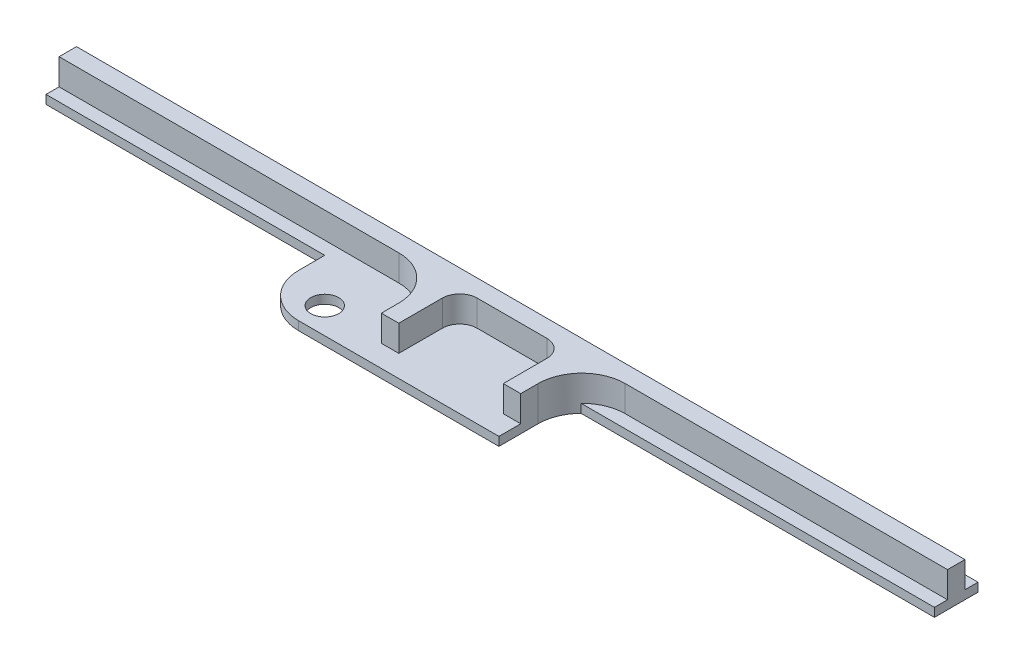
ISO-10303-21;
HEADER;
FILE_DESCRIPTION(('STEP AP214'),'2;1');
FILE_NAME('part.step','',(''),(''),'','','');
FILE_SCHEMA(('AUTOMOTIVE_DESIGN { 1 0 10303 214 1 1 1 1 }'));
ENDSEC;
DATA;
#1=APPLICATION_CONTEXT('core data for automotive mechanical design processes');
#2=APPLICATION_PROTOCOL_DEFINITION('international standard','automotive_design',2000,#1);
#3=PRODUCT_CONTEXT('',#1,'mechanical');
#4=PRODUCT('Part','Part','',(#3));
#5=PRODUCT_RELATED_PRODUCT_CATEGORY('part','',(#4));
#6=PRODUCT_DEFINITION_FORMATION('','',#4);
#7=PRODUCT_DEFINITION_CONTEXT('part definition',#1,'design');
#8=PRODUCT_DEFINITION('design','',#6,#7);
#9=PRODUCT_DEFINITION_SHAPE('','',#8);
#10=(LENGTH_UNIT() NAMED_UNIT(*) SI_UNIT(.MILLI.,.METRE.));
#11=(NAMED_UNIT(*) PLANE_ANGLE_UNIT() SI_UNIT($,.RADIAN.));
#12=(NAMED_UNIT(*) SI_UNIT($,.STERADIAN.) SOLID_ANGLE_UNIT());
#13=UNCERTAINTY_MEASURE_WITH_UNIT(LENGTH_MEASURE(1.E-05),#10,'distance_accuracy_value','');
#14=(GEOMETRIC_REPRESENTATION_CONTEXT(3) GLOBAL_UNCERTAINTY_ASSIGNED_CONTEXT((#13)) GLOBAL_UNIT_ASSIGNED_CONTEXT((#10,
#11,#12)) REPRESENTATION_CONTEXT('',''));
#15=CARTESIAN_POINT('',(0.,0.,0.));
#16=DIRECTION('',(0.,0.,1.));
#17=DIRECTION('',(1.,0.,0.));
#18=AXIS2_PLACEMENT_3D('',#15,#16,#17);
#19=CARTESIAN_POINT('',(0.,1.,0.));
#20=DIRECTION('',(0.,1.,0.));
#21=DIRECTION('',(0.,0.,1.));
#22=AXIS2_PLACEMENT_3D('',#19,#20,#21);
#23=PLANE('',#22);
#24=DIRECTION('',(0.,0.,1.));
#25=VECTOR('',#24,1.);
#26=CARTESIAN_POINT('',(23.,1.,0.5));
#27=LINE('',#26,#25);
#28=CARTESIAN_POINT('',(23.,1.,0.5));
#29=VERTEX_POINT('',#28);
#30=CARTESIAN_POINT('',(23.,1.,3.));
#31=VERTEX_POINT('',#30);
#32=EDGE_CURVE('E207',#29,#31,#27,.T.);
#33=ORIENTED_EDGE('',*,*,#32,.F.);
#34=DIRECTION('',(1.,0.,0.));
#35=VECTOR('',#34,1.);
#36=CARTESIAN_POINT('',(23.,1.,0.5));
#37=LINE('',#36,#35);
#38=CARTESIAN_POINT('',(21.,1.,0.5));
#39=VERTEX_POINT('',#38);
#40=EDGE_CURVE('E408',#39,#29,#37,.T.);
#41=ORIENTED_EDGE('',*,*,#40,.F.);
#42=DIRECTION('',(0.,0.,1.));
#43=VECTOR('',#42,1.);
#44=CARTESIAN_POINT('',(21.,1.,-6.5));
#45=LINE('',#44,#43);
#46=CARTESIAN_POINT('',(21.,1.,-4.5));
#47=VERTEX_POINT('',#46);
#48=EDGE_CURVE('E344',#47,#39,#45,.T.);
#49=ORIENTED_EDGE('',*,*,#48,.F.);
#50=CARTESIAN_POINT('',(19.,1.,-4.5));
#51=DIRECTION('',(0.,1.,0.));
#52=DIRECTION('',(0.,0.,1.));
#53=AXIS2_PLACEMENT_3D('',#50,#51,#52);
#54=CIRCLE('',#53,2.);
#55=CARTESIAN_POINT('',(19.,1.,-6.5));
#56=VERTEX_POINT('',#55);
#57=EDGE_CURVE('E312',#47,#56,#54,.T.);
#58=ORIENTED_EDGE('',*,*,#57,.T.);
#59=DIRECTION('',(1.,0.,0.));
#60=VECTOR('',#59,1.);
#61=CARTESIAN_POINT('',(-37.,1.,-6.5));
#62=LINE('',#61,#60);
#63=CARTESIAN_POINT('',(11.,1.,-6.5));
#64=VERTEX_POINT('',#63);
#65=EDGE_CURVE('E343',#64,#56,#62,.T.);
#66=ORIENTED_EDGE('',*,*,#65,.F.);
#67=CARTESIAN_POINT('',(11.,1.,-4.5));
#68=DIRECTION('',(0.,1.,0.));
#69=DIRECTION('',(0.,0.,1.));
#70=AXIS2_PLACEMENT_3D('',#67,#68,#69);
#71=CIRCLE('',#70,2.);
#72=CARTESIAN_POINT('',(9.,1.,-4.5));
#73=VERTEX_POINT('',#72);
#74=EDGE_CURVE('E310',#64,#73,#71,.T.);
#75=ORIENTED_EDGE('',*,*,#74,.T.);
#76=DIRECTION('',(0.,0.,-1.));
#77=VECTOR('',#76,1.);
#78=CARTESIAN_POINT('',(9.,1.,-6.5));
#79=LINE('',#78,#77);
#80=CARTESIAN_POINT('',(9.,1.,0.5));
#81=VERTEX_POINT('',#80);
#82=EDGE_CURVE('E418',#81,#73,#79,.T.);
#83=ORIENTED_EDGE('',*,*,#82,.F.);
#84=DIRECTION('',(1.,0.,0.));
#85=VECTOR('',#84,1.);
#86=CARTESIAN_POINT('',(7.,1.,0.5));
#87=LINE('',#86,#85);
#88=CARTESIAN_POINT('',(7.,1.,0.5));
#89=VERTEX_POINT('',#88);
#90=EDGE_CURVE('E424',#89,#81,#87,.T.);
#91=ORIENTED_EDGE('',*,*,#90,.F.);
#92=DIRECTION('',(0.,0.,1.));
#93=VECTOR('',#92,1.);
#94=CARTESIAN_POINT('',(7.,1.,-6.5));
#95=LINE('',#94,#93);
#96=CARTESIAN_POINT('',(7.,1.,-1.5));
#97=VERTEX_POINT('',#96);
#98=EDGE_CURVE('E411',#97,#89,#95,.T.);
#99=ORIENTED_EDGE('',*,*,#98,.F.);
#100=CARTESIAN_POINT('',(2.,1.,-1.5));
#101=DIRECTION('',(0.,1.,0.));
#102=DIRECTION('',(0.,0.,1.));
#103=AXIS2_PLACEMENT_3D('',#100,#101,#102);
#104=CIRCLE('',#103,5.);
#105=CARTESIAN_POINT('',(2.,1.,-6.5));
#106=VERTEX_POINT('',#105);
#107=EDGE_CURVE('E285',#97,#106,#104,.T.);
#108=ORIENTED_EDGE('',*,*,#107,.T.);
#109=CARTESIAN_POINT('',(-37.,1.,-6.5));
#110=VERTEX_POINT('',#109);
#111=EDGE_CURVE('E348',#110,#106,#62,.T.);
#112=ORIENTED_EDGE('',*,*,#111,.F.);
#113=DIRECTION('',(0.,0.,1.));
#114=VECTOR('',#113,1.);
#115=CARTESIAN_POINT('',(-37.,1.,-9.99999999999999));
#116=LINE('',#115,#114);
#117=CARTESIAN_POINT('',(-37.,1.,-5.));
#118=VERTEX_POINT('',#117);
#119=EDGE_CURVE('E380',#110,#118,#116,.T.);
#120=ORIENTED_EDGE('',*,*,#119,.T.);
#121=DIRECTION('',(1.,0.,0.));
#122=VECTOR('',#121,1.);
#123=CARTESIAN_POINT('',(-37.,1.,-5.));
#124=LINE('',#123,#122);
#125=CARTESIAN_POINT('',(-5.,1.,-5.));
#126=VERTEX_POINT('',#125);
#127=EDGE_CURVE('E242',#118,#126,#124,.T.);
#128=ORIENTED_EDGE('',*,*,#127,.T.);
#129=DIRECTION('',(0.,0.,1.));
#130=VECTOR('',#129,1.);
#131=CARTESIAN_POINT('',(-5.,1.,-5.));
#132=LINE('',#131,#130);
#133=CARTESIAN_POINT('',(-5.,1.,-2.));
#134=VERTEX_POINT('',#133);
#135=EDGE_CURVE('E238',#126,#134,#132,.T.);
#136=ORIENTED_EDGE('',*,*,#135,.T.);
#137=CARTESIAN_POINT('',(0.,1.,-2.));
#138=DIRECTION('',(0.,1.,0.));
#139=DIRECTION('',(0.,0.,1.));
#140=AXIS2_PLACEMENT_3D('',#137,#138,#139);
#141=CIRCLE('',#140,5.);
#142=CARTESIAN_POINT('',(0.,1.,3.));
#143=VERTEX_POINT('',#142);
#144=EDGE_CURVE('E237',#134,#143,#141,.T.);
#145=ORIENTED_EDGE('',*,*,#144,.T.);
#146=DIRECTION('',(1.,0.,0.));
#147=VECTOR('',#146,1.);
#148=CARTESIAN_POINT('',(-5.,1.,3.));
#149=LINE('',#148,#147);
#150=EDGE_CURVE('E228',#143,#31,#149,.T.);
#151=ORIENTED_EDGE('',*,*,#150,.T.);
#152=EDGE_LOOP('',(#33,#41,#49,#58,#66,#75,#83,#91,#99,#108,#112,#120,#128,#136,#145,#151));
#153=FACE_BOUND('',#152,.T.);
#154=CARTESIAN_POINT('',(0.,1.,0.));
#155=DIRECTION('',(0.,1.,0.));
#156=DIRECTION('',(0.,0.,1.));
#157=AXIS2_PLACEMENT_3D('',#154,#155,#156);
#158=CIRCLE('',#157,1.6);
#159=CARTESIAN_POINT('',(0.,1.,1.6));
#160=VERTEX_POINT('',#159);
#161=EDGE_CURVE('E254',#160,#160,#158,.T.);
#162=ORIENTED_EDGE('',*,*,#161,.F.);
#163=EDGE_LOOP('',(#162));
#164=FACE_BOUND('',#163,.T.);
#165=ADVANCED_FACE('F39',(#153,#164),#23,.T.);
#166=CARTESIAN_POINT('',(28.,1.,-1.5));
#167=DIRECTION('',(0.,1.,0.));
#168=DIRECTION('',(0.,0.,1.));
#169=AXIS2_PLACEMENT_3D('',#166,#167,#168);
#170=CIRCLE('',#169,5.);
#171=CARTESIAN_POINT('',(28.,1.,-6.5));
#172=VERTEX_POINT('',#171);
#173=CARTESIAN_POINT('',(24.4292857857286,1.,-5.));
#174=VERTEX_POINT('',#173);
#175=EDGE_CURVE('E287',#172,#174,#170,.T.);
#176=ORIENTED_EDGE('',*,*,#175,.T.);
#177=DIRECTION('',(1.,0.,0.));
#178=VECTOR('',#177,1.);
#179=CARTESIAN_POINT('',(35.,1.,-5.));
#180=LINE('',#179,#178);
#181=CARTESIAN_POINT('',(65.,1.,-5.));
#182=VERTEX_POINT('',#181);
#183=EDGE_CURVE('E54',#174,#182,#180,.T.);
#184=ORIENTED_EDGE('',*,*,#183,.T.);
#185=DIRECTION('',(0.,0.,-1.));
#186=VECTOR('',#185,1.);
#187=CARTESIAN_POINT('',(65.,1.,-5.));
#188=LINE('',#187,#186);
#189=CARTESIAN_POINT('',(65.,1.,-6.5));
#190=VERTEX_POINT('',#189);
#191=EDGE_CURVE('E246',#182,#190,#188,.T.);
#192=ORIENTED_EDGE('',*,*,#191,.T.);
#193=EDGE_CURVE('E349',#172,#190,#62,.T.);
#194=ORIENTED_EDGE('',*,*,#193,.F.);
#195=EDGE_LOOP('',(#176,#184,#192,#194));
#196=FACE_BOUND('',#195,.T.);
#197=ADVANCED_FACE('F473',(#196),#23,.T.);
#198=CARTESIAN_POINT('',(-37.,4.,-6.5));
#199=DIRECTION('',(0.,0.,-1.));
#200=DIRECTION('',(-1.,0.,0.));
#201=AXIS2_PLACEMENT_3D('',#198,#199,#200);
#202=PLANE('',#201);
#203=DIRECTION('',(1.,0.,0.));
#204=VECTOR('',#203,1.);
#205=CARTESIAN_POINT('',(-37.,4.,-6.5));
#206=LINE('',#205,#204);
#207=CARTESIAN_POINT('',(28.,4.,-6.5));
#208=VERTEX_POINT('',#207);
#209=CARTESIAN_POINT('',(65.,4.,-6.5));
#210=VERTEX_POINT('',#209);
#211=EDGE_CURVE('E432',#208,#210,#206,.T.);
#212=ORIENTED_EDGE('',*,*,#211,.F.);
#213=DIRECTION('',(0.,-1.,0.));
#214=VECTOR('',#213,1.);
#215=CARTESIAN_POINT('',(28.,1.,-6.5));
#216=LINE('',#215,#214);
#217=EDGE_CURVE('E293',#208,#172,#216,.T.);
#218=ORIENTED_EDGE('',*,*,#217,.T.);
#219=ORIENTED_EDGE('',*,*,#193,.T.);
#220=DIRECTION('',(0.,-1.,0.));
#221=VECTOR('',#220,1.);
#222=CARTESIAN_POINT('',(65.,4.,-6.5));
#223=LINE('',#222,#221);
#224=EDGE_CURVE('E367',#210,#190,#223,.T.);
#225=ORIENTED_EDGE('',*,*,#224,.F.);
#226=EDGE_LOOP('',(#212,#218,#219,#225));
#227=FACE_BOUND('',#226,.T.);
#228=ADVANCED_FACE('F479',(#227),#202,.F.);
#229=ORIENTED_EDGE('',*,*,#65,.T.);
#230=DIRECTION('',(0.,-1.,0.));
#231=VECTOR('',#230,1.);
#232=CARTESIAN_POINT('',(19.,4.,-6.5));
#233=LINE('',#232,#231);
#234=CARTESIAN_POINT('',(19.,4.,-6.5));
#235=VERTEX_POINT('',#234);
#236=EDGE_CURVE('E317',#56,#235,#233,.F.);
#237=ORIENTED_EDGE('',*,*,#236,.T.);
#238=CARTESIAN_POINT('',(11.,4.,-6.5));
#239=VERTEX_POINT('',#238);
#240=EDGE_CURVE('E328',#239,#235,#206,.T.);
#241=ORIENTED_EDGE('',*,*,#240,.F.);
#242=DIRECTION('',(0.,-1.,0.));
#243=VECTOR('',#242,1.);
#244=CARTESIAN_POINT('',(11.,1.,-6.5));
#245=LINE('',#244,#243);
#246=EDGE_CURVE('E314',#239,#64,#245,.T.);
#247=ORIENTED_EDGE('',*,*,#246,.T.);
#248=EDGE_LOOP('',(#229,#237,#241,#247));
#249=FACE_BOUND('',#248,.T.);
#250=ADVANCED_FACE('F346',(#249),#202,.F.);
#251=ORIENTED_EDGE('',*,*,#111,.T.);
#252=DIRECTION('',(0.,-1.,0.));
#253=VECTOR('',#252,1.);
#254=CARTESIAN_POINT('',(2.,4.,-6.5));
#255=LINE('',#254,#253);
#256=CARTESIAN_POINT('',(2.,4.,-6.5));
#257=VERTEX_POINT('',#256);
#258=EDGE_CURVE('E301',#106,#257,#255,.F.);
#259=ORIENTED_EDGE('',*,*,#258,.T.);
#260=CARTESIAN_POINT('',(-37.,4.,-6.5));
#261=VERTEX_POINT('',#260);
#262=EDGE_CURVE('E433',#261,#257,#206,.T.);
#263=ORIENTED_EDGE('',*,*,#262,.F.);
#264=DIRECTION('',(0.,-1.,0.));
#265=VECTOR('',#264,1.);
#266=CARTESIAN_POINT('',(-37.,4.,-6.5));
#267=LINE('',#266,#265);
#268=EDGE_CURVE('E370',#261,#110,#267,.T.);
#269=ORIENTED_EDGE('',*,*,#268,.T.);
#270=EDGE_LOOP('',(#251,#259,#263,#269));
#271=FACE_BOUND('',#270,.T.);
#272=ADVANCED_FACE('F447',(#271),#202,.F.);
#273=DIRECTION('',(-1.,0.,0.));
#274=VECTOR('',#273,1.);
#275=CARTESIAN_POINT('',(-37.,1.,-8.5));
#276=LINE('',#275,#274);
#277=CARTESIAN_POINT('',(65.,1.,-8.5));
#278=VERTEX_POINT('',#277);
#279=CARTESIAN_POINT('',(-37.,1.,-8.5));
#280=VERTEX_POINT('',#279);
#281=EDGE_CURVE('E352',#278,#280,#276,.T.);
#282=ORIENTED_EDGE('',*,*,#281,.F.);
#283=CARTESIAN_POINT('',(65.,1.,-10.));
#284=VERTEX_POINT('',#283);
#285=EDGE_CURVE('E240',#278,#284,#188,.T.);
#286=ORIENTED_EDGE('',*,*,#285,.T.);
#287=DIRECTION('',(-1.,0.,0.));
#288=VECTOR('',#287,1.);
#289=CARTESIAN_POINT('',(65.,1.,-10.));
#290=LINE('',#289,#288);
#291=CARTESIAN_POINT('',(-37.,1.,-9.99999999999999));
#292=VERTEX_POINT('',#291);
#293=EDGE_CURVE('E266',#284,#292,#290,.T.);
#294=ORIENTED_EDGE('',*,*,#293,.T.);
#295=EDGE_CURVE('E381',#292,#280,#116,.T.);
#296=ORIENTED_EDGE('',*,*,#295,.T.);
#297=EDGE_LOOP('',(#282,#286,#294,#296));
#298=FACE_BOUND('',#297,.T.);
#299=ADVANCED_FACE('F475',(#298),#23,.T.);
#300=CARTESIAN_POINT('',(0.,0.,0.));
#301=DIRECTION('',(0.,1.,0.));
#302=DIRECTION('',(0.,0.,1.));
#303=AXIS2_PLACEMENT_3D('',#300,#301,#302);
#304=PLANE('',#303);
#305=CARTESIAN_POINT('',(28.,0.,-1.5));
#306=DIRECTION('',(0.,1.,0.));
#307=DIRECTION('',(0.,0.,1.));
#308=AXIS2_PLACEMENT_3D('',#305,#306,#307);
#309=CIRCLE('',#308,5.);
#310=CARTESIAN_POINT('',(23.,0.,-1.5));
#311=VERTEX_POINT('',#310);
#312=CARTESIAN_POINT('',(24.4292857857286,0.,-5.));
#313=VERTEX_POINT('',#312);
#314=EDGE_CURVE('E401',#311,#313,#309,.F.);
#315=ORIENTED_EDGE('',*,*,#314,.F.);
#316=DIRECTION('',(0.,0.,-1.));
#317=VECTOR('',#316,1.);
#318=CARTESIAN_POINT('',(23.,0.,0.5));
#319=LINE('',#318,#317);
#320=CARTESIAN_POINT('',(23.,0.,3.));
#321=VERTEX_POINT('',#320);
#322=EDGE_CURVE('E221',#321,#311,#319,.T.);
#323=ORIENTED_EDGE('',*,*,#322,.F.);
#324=DIRECTION('',(1.,0.,0.));
#325=VECTOR('',#324,1.);
#326=CARTESIAN_POINT('',(-5.,0.,3.));
#327=LINE('',#326,#325);
#328=CARTESIAN_POINT('',(0.,0.,3.));
#329=VERTEX_POINT('',#328);
#330=EDGE_CURVE('E231',#329,#321,#327,.T.);
#331=ORIENTED_EDGE('',*,*,#330,.F.);
#332=CARTESIAN_POINT('',(0.,0.,-2.));
#333=DIRECTION('',(0.,1.,0.));
#334=DIRECTION('',(0.,0.,1.));
#335=AXIS2_PLACEMENT_3D('',#332,#333,#334);
#336=CIRCLE('',#335,5.);
#337=CARTESIAN_POINT('',(-5.,0.,-2.));
#338=VERTEX_POINT('',#337);
#339=EDGE_CURVE('E281',#329,#338,#336,.F.);
#340=ORIENTED_EDGE('',*,*,#339,.T.);
#341=DIRECTION('',(0.,0.,1.));
#342=VECTOR('',#341,1.);
#343=CARTESIAN_POINT('',(-5.,0.,-5.));
#344=LINE('',#343,#342);
#345=CARTESIAN_POINT('',(-5.,0.,-5.));
#346=VERTEX_POINT('',#345);
#347=EDGE_CURVE('E258',#346,#338,#344,.T.);
#348=ORIENTED_EDGE('',*,*,#347,.F.);
#349=DIRECTION('',(1.,0.,0.));
#350=VECTOR('',#349,1.);
#351=CARTESIAN_POINT('',(-37.,0.,-5.));
#352=LINE('',#351,#350);
#353=CARTESIAN_POINT('',(-37.,0.,-5.));
#354=VERTEX_POINT('',#353);
#355=EDGE_CURVE('E256',#354,#346,#352,.T.);
#356=ORIENTED_EDGE('',*,*,#355,.F.);
#357=DIRECTION('',(0.,0.,1.));
#358=VECTOR('',#357,1.);
#359=CARTESIAN_POINT('',(-37.,0.,-9.99999999999999));
#360=LINE('',#359,#358);
#361=CARTESIAN_POINT('',(-37.,0.,-9.99999999999999));
#362=VERTEX_POINT('',#361);
#363=EDGE_CURVE('E253',#362,#354,#360,.T.);
#364=ORIENTED_EDGE('',*,*,#363,.F.);
#365=DIRECTION('',(-1.,0.,0.));
#366=VECTOR('',#365,1.);
#367=CARTESIAN_POINT('',(65.,0.,-10.));
#368=LINE('',#367,#366);
#369=CARTESIAN_POINT('',(65.,0.,-10.));
#370=VERTEX_POINT('',#369);
#371=EDGE_CURVE('E250',#370,#362,#368,.T.);
#372=ORIENTED_EDGE('',*,*,#371,.F.);
#373=DIRECTION('',(0.,0.,-1.));
#374=VECTOR('',#373,1.);
#375=CARTESIAN_POINT('',(65.,0.,-5.));
#376=LINE('',#375,#374);
#377=CARTESIAN_POINT('',(65.,0.,-5.));
#378=VERTEX_POINT('',#377);
#379=EDGE_CURVE('E264',#378,#370,#376,.T.);
#380=ORIENTED_EDGE('',*,*,#379,.F.);
#381=DIRECTION('',(1.,0.,0.));
#382=VECTOR('',#381,1.);
#383=CARTESIAN_POINT('',(35.,0.,-5.));
#384=LINE('',#383,#382);
#385=EDGE_CURVE('E262',#313,#378,#384,.T.);
#386=ORIENTED_EDGE('',*,*,#385,.F.);
#387=EDGE_LOOP('',(#315,#323,#331,#340,#348,#356,#364,#372,#380,#386));
#388=FACE_BOUND('',#387,.T.);
#389=CARTESIAN_POINT('',(0.,0.,0.));
#390=DIRECTION('',(0.,1.,0.));
#391=DIRECTION('',(0.,0.,1.));
#392=AXIS2_PLACEMENT_3D('',#389,#390,#391);
#393=CIRCLE('',#392,1.6);
#394=CARTESIAN_POINT('',(0.,0.,1.6));
#395=VERTEX_POINT('',#394);
#396=EDGE_CURVE('E373',#395,#395,#393,.T.);
#397=ORIENTED_EDGE('',*,*,#396,.T.);
#398=EDGE_LOOP('',(#397));
#399=FACE_BOUND('',#398,.T.);
#400=ADVANCED_FACE('F398',(#388,#399),#304,.F.);
#401=CARTESIAN_POINT('',(65.,1.,-10.));
#402=DIRECTION('',(0.,0.,1.));
#403=DIRECTION('',(1.,0.,0.));
#404=AXIS2_PLACEMENT_3D('',#401,#402,#403);
#405=PLANE('',#404);
#406=ORIENTED_EDGE('',*,*,#371,.T.);
#407=DIRECTION('',(0.,-1.,0.));
#408=VECTOR('',#407,1.);
#409=CARTESIAN_POINT('',(-37.,1.,-9.99999999999999));
#410=LINE('',#409,#408);
#411=EDGE_CURVE('E278',#292,#362,#410,.T.);
#412=ORIENTED_EDGE('',*,*,#411,.F.);
#413=ORIENTED_EDGE('',*,*,#293,.F.);
#414=DIRECTION('',(0.,-1.,0.));
#415=VECTOR('',#414,1.);
#416=CARTESIAN_POINT('',(65.,1.,-10.));
#417=LINE('',#416,#415);
#418=EDGE_CURVE('E249',#284,#370,#417,.T.);
#419=ORIENTED_EDGE('',*,*,#418,.T.);
#420=EDGE_LOOP('',(#406,#412,#413,#419));
#421=FACE_BOUND('',#420,.T.);
#422=ADVANCED_FACE('F490',(#421),#405,.F.);
#423=CARTESIAN_POINT('',(-37.,1.,-9.99999999999999));
#424=DIRECTION('',(1.,0.,0.));
#425=DIRECTION('',(0.,0.,-1.));
#426=AXIS2_PLACEMENT_3D('',#423,#424,#425);
#427=PLANE('',#426);
#428=ORIENTED_EDGE('',*,*,#363,.T.);
#429=DIRECTION('',(0.,-1.,0.));
#430=VECTOR('',#429,1.);
#431=CARTESIAN_POINT('',(-37.,1.,-5.));
#432=LINE('',#431,#430);
#433=EDGE_CURVE('E275',#118,#354,#432,.T.);
#434=ORIENTED_EDGE('',*,*,#433,.F.);
#435=ORIENTED_EDGE('',*,*,#119,.F.);
#436=ORIENTED_EDGE('',*,*,#268,.F.);
#437=DIRECTION('',(0.,0.,1.));
#438=VECTOR('',#437,1.);
#439=CARTESIAN_POINT('',(-37.,4.,-8.5));
#440=LINE('',#439,#438);
#441=CARTESIAN_POINT('',(-37.,4.,-8.5));
#442=VERTEX_POINT('',#441);
#443=EDGE_CURVE('E360',#442,#261,#440,.T.);
#444=ORIENTED_EDGE('',*,*,#443,.F.);
#445=DIRECTION('',(0.,-1.,0.));
#446=VECTOR('',#445,1.);
#447=CARTESIAN_POINT('',(-37.,4.,-8.5));
#448=LINE('',#447,#446);
#449=EDGE_CURVE('E361',#442,#280,#448,.T.);
#450=ORIENTED_EDGE('',*,*,#449,.T.);
#451=ORIENTED_EDGE('',*,*,#295,.F.);
#452=ORIENTED_EDGE('',*,*,#411,.T.);
#453=EDGE_LOOP('',(#428,#434,#435,#436,#444,#450,#451,#452));
#454=FACE_BOUND('',#453,.T.);
#455=ADVANCED_FACE('F445',(#454),#427,.F.);
#456=CARTESIAN_POINT('',(-37.,1.,-5.));
#457=DIRECTION('',(0.,0.,-1.));
#458=DIRECTION('',(-1.,0.,0.));
#459=AXIS2_PLACEMENT_3D('',#456,#457,#458);
#460=PLANE('',#459);
#461=ORIENTED_EDGE('',*,*,#355,.T.);
#462=DIRECTION('',(0.,-1.,0.));
#463=VECTOR('',#462,1.);
#464=CARTESIAN_POINT('',(-5.,1.,-5.));
#465=LINE('',#464,#463);
#466=EDGE_CURVE('E272',#126,#346,#465,.T.);
#467=ORIENTED_EDGE('',*,*,#466,.F.);
#468=ORIENTED_EDGE('',*,*,#127,.F.);
#469=ORIENTED_EDGE('',*,*,#433,.T.);
#470=EDGE_LOOP('',(#461,#467,#468,#469));
#471=FACE_BOUND('',#470,.T.);
#472=ADVANCED_FACE('F388',(#471),#460,.F.);
#473=CARTESIAN_POINT('',(-5.,1.,-5.));
#474=DIRECTION('',(1.,0.,0.));
#475=DIRECTION('',(0.,0.,-1.));
#476=AXIS2_PLACEMENT_3D('',#473,#474,#475);
#477=PLANE('',#476);
#478=ORIENTED_EDGE('',*,*,#347,.T.);
#479=DIRECTION('',(0.,-1.,0.));
#480=VECTOR('',#479,1.);
#481=CARTESIAN_POINT('',(-5.,1.,-2.));
#482=LINE('',#481,#480);
#483=EDGE_CURVE('E291',#338,#134,#482,.F.);
#484=ORIENTED_EDGE('',*,*,#483,.T.);
#485=ORIENTED_EDGE('',*,*,#135,.F.);
#486=ORIENTED_EDGE('',*,*,#466,.T.);
#487=EDGE_LOOP('',(#478,#484,#485,#486));
#488=FACE_BOUND('',#487,.T.);
#489=ADVANCED_FACE('F392',(#488),#477,.F.);
#490=CARTESIAN_POINT('',(-5.,1.,3.));
#491=DIRECTION('',(0.,0.,-1.));
#492=DIRECTION('',(-1.,0.,0.));
#493=AXIS2_PLACEMENT_3D('',#490,#491,#492);
#494=PLANE('',#493);
#495=ORIENTED_EDGE('',*,*,#330,.T.);
#496=DIRECTION('',(0.,1.,0.));
#497=VECTOR('',#496,1.);
#498=CARTESIAN_POINT('',(23.,-0.000999999999999916,3.));
#499=LINE('',#498,#497);
#500=EDGE_CURVE('E211',#321,#31,#499,.T.);
#501=ORIENTED_EDGE('',*,*,#500,.T.);
#502=ORIENTED_EDGE('',*,*,#150,.F.);
#503=DIRECTION('',(0.,-1.,0.));
#504=VECTOR('',#503,1.);
#505=CARTESIAN_POINT('',(0.,1.,3.));
#506=LINE('',#505,#504);
#507=EDGE_CURVE('E283',#143,#329,#506,.T.);
#508=ORIENTED_EDGE('',*,*,#507,.T.);
#509=EDGE_LOOP('',(#495,#501,#502,#508));
#510=FACE_BOUND('',#509,.T.);
#511=ADVANCED_FACE('F226',(#510),#494,.F.);
#512=CARTESIAN_POINT('',(35.,1.,-5.));
#513=DIRECTION('',(0.,0.,-1.));
#514=DIRECTION('',(-1.,0.,0.));
#515=AXIS2_PLACEMENT_3D('',#512,#513,#514);
#516=PLANE('',#515);
#517=ORIENTED_EDGE('',*,*,#385,.T.);
#518=DIRECTION('',(0.,-1.,0.));
#519=VECTOR('',#518,1.);
#520=CARTESIAN_POINT('',(65.,1.,-5.));
#521=LINE('',#520,#519);
#522=EDGE_CURVE('E269',#182,#378,#521,.T.);
#523=ORIENTED_EDGE('',*,*,#522,.F.);
#524=ORIENTED_EDGE('',*,*,#183,.F.);
#525=DIRECTION('',(0.,1.,0.));
#526=VECTOR('',#525,1.);
#527=CARTESIAN_POINT('',(24.4292857857286,-0.000999999999999916,-5.));
#528=LINE('',#527,#526);
#529=EDGE_CURVE('E220',#313,#174,#528,.T.);
#530=ORIENTED_EDGE('',*,*,#529,.F.);
#531=EDGE_LOOP('',(#517,#523,#524,#530));
#532=FACE_BOUND('',#531,.T.);
#533=ADVANCED_FACE('F501',(#532),#516,.F.);
#534=CARTESIAN_POINT('',(65.,1.,-5.));
#535=DIRECTION('',(-1.,0.,0.));
#536=DIRECTION('',(0.,0.,1.));
#537=AXIS2_PLACEMENT_3D('',#534,#535,#536);
#538=PLANE('',#537);
#539=ORIENTED_EDGE('',*,*,#379,.T.);
#540=ORIENTED_EDGE('',*,*,#418,.F.);
#541=ORIENTED_EDGE('',*,*,#285,.F.);
#542=DIRECTION('',(0.,-1.,0.));
#543=VECTOR('',#542,1.);
#544=CARTESIAN_POINT('',(65.,4.,-8.5));
#545=LINE('',#544,#543);
#546=CARTESIAN_POINT('',(65.,4.,-8.5));
#547=VERTEX_POINT('',#546);
#548=EDGE_CURVE('E364',#547,#278,#545,.T.);
#549=ORIENTED_EDGE('',*,*,#548,.F.);
#550=DIRECTION('',(0.,0.,-1.));
#551=VECTOR('',#550,1.);
#552=CARTESIAN_POINT('',(65.,4.,-8.5));
#553=LINE('',#552,#551);
#554=EDGE_CURVE('E435',#210,#547,#553,.T.);
#555=ORIENTED_EDGE('',*,*,#554,.F.);
#556=ORIENTED_EDGE('',*,*,#224,.T.);
#557=ORIENTED_EDGE('',*,*,#191,.F.);
#558=ORIENTED_EDGE('',*,*,#522,.T.);
#559=EDGE_LOOP('',(#539,#540,#541,#549,#555,#556,#557,#558));
#560=FACE_BOUND('',#559,.T.);
#561=ADVANCED_FACE('F495',(#560),#538,.F.);
#562=CARTESIAN_POINT('',(0.,1.,0.));
#563=DIRECTION('',(0.,-1.,0.));
#564=DIRECTION('',(0.,0.,-1.));
#565=AXIS2_PLACEMENT_3D('',#562,#563,#564);
#566=CYLINDRICAL_SURFACE('',#565,1.6);
#567=ORIENTED_EDGE('',*,*,#161,.T.);
#568=EDGE_LOOP('',(#567));
#569=FACE_BOUND('',#568,.T.);
#570=ORIENTED_EDGE('',*,*,#396,.F.);
#571=EDGE_LOOP('',(#570));
#572=FACE_BOUND('',#571,.T.);
#573=ADVANCED_FACE('F530',(#569,#572),#566,.F.);
#574=CARTESIAN_POINT('',(-37.,4.,-8.5));
#575=DIRECTION('',(0.,0.,1.));
#576=DIRECTION('',(1.,0.,0.));
#577=AXIS2_PLACEMENT_3D('',#574,#575,#576);
#578=PLANE('',#577);
#579=ORIENTED_EDGE('',*,*,#281,.T.);
#580=ORIENTED_EDGE('',*,*,#449,.F.);
#581=DIRECTION('',(-1.,0.,0.));
#582=VECTOR('',#581,1.);
#583=CARTESIAN_POINT('',(-37.,4.,-8.5));
#584=LINE('',#583,#582);
#585=EDGE_CURVE('E356',#547,#442,#584,.T.);
#586=ORIENTED_EDGE('',*,*,#585,.F.);
#587=ORIENTED_EDGE('',*,*,#548,.T.);
#588=EDGE_LOOP('',(#579,#580,#586,#587));
#589=FACE_BOUND('',#588,.T.);
#590=ADVANCED_FACE('F443',(#589),#578,.F.);
#591=CARTESIAN_POINT('',(0.,4.,0.));
#592=DIRECTION('',(0.,1.,0.));
#593=DIRECTION('',(0.,0.,1.));
#594=AXIS2_PLACEMENT_3D('',#591,#592,#593);
#595=PLANE('',#594);
#596=ORIENTED_EDGE('',*,*,#443,.T.);
#597=ORIENTED_EDGE('',*,*,#262,.T.);
#598=CARTESIAN_POINT('',(2.,4.,-1.5));
#599=DIRECTION('',(0.,1.,0.));
#600=DIRECTION('',(0.,0.,1.));
#601=AXIS2_PLACEMENT_3D('',#598,#599,#600);
#602=CIRCLE('',#601,5.);
#603=CARTESIAN_POINT('',(7.,4.,-1.5));
#604=VERTEX_POINT('',#603);
#605=EDGE_CURVE('E305',#257,#604,#602,.F.);
#606=ORIENTED_EDGE('',*,*,#605,.T.);
#607=DIRECTION('',(0.,0.,1.));
#608=VECTOR('',#607,1.);
#609=CARTESIAN_POINT('',(7.,4.,-6.5));
#610=LINE('',#609,#608);
#611=CARTESIAN_POINT('',(7.,4.,0.5));
#612=VERTEX_POINT('',#611);
#613=EDGE_CURVE('E415',#604,#612,#610,.T.);
#614=ORIENTED_EDGE('',*,*,#613,.T.);
#615=DIRECTION('',(1.,0.,0.));
#616=VECTOR('',#615,1.);
#617=CARTESIAN_POINT('',(7.,4.,0.5));
#618=LINE('',#617,#616);
#619=CARTESIAN_POINT('',(9.,4.,0.5));
#620=VERTEX_POINT('',#619);
#621=EDGE_CURVE('E417',#612,#620,#618,.T.);
#622=ORIENTED_EDGE('',*,*,#621,.T.);
#623=DIRECTION('',(0.,0.,-1.));
#624=VECTOR('',#623,1.);
#625=CARTESIAN_POINT('',(9.,4.,-6.5));
#626=LINE('',#625,#624);
#627=CARTESIAN_POINT('',(9.,4.,-4.5));
#628=VERTEX_POINT('',#627);
#629=EDGE_CURVE('E420',#620,#628,#626,.T.);
#630=ORIENTED_EDGE('',*,*,#629,.T.);
#631=CARTESIAN_POINT('',(11.,4.,-4.5));
#632=DIRECTION('',(0.,1.,0.));
#633=DIRECTION('',(0.,0.,1.));
#634=AXIS2_PLACEMENT_3D('',#631,#632,#633);
#635=CIRCLE('',#634,2.);
#636=EDGE_CURVE('E11',#628,#239,#635,.F.);
#637=ORIENTED_EDGE('',*,*,#636,.T.);
#638=ORIENTED_EDGE('',*,*,#240,.T.);
#639=CARTESIAN_POINT('',(19.,4.,-4.5));
#640=DIRECTION('',(0.,1.,0.));
#641=DIRECTION('',(0.,0.,1.));
#642=AXIS2_PLACEMENT_3D('',#639,#640,#641);
#643=CIRCLE('',#642,2.);
#644=CARTESIAN_POINT('',(21.,4.,-4.5));
#645=VERTEX_POINT('',#644);
#646=EDGE_CURVE('E47',#235,#645,#643,.F.);
#647=ORIENTED_EDGE('',*,*,#646,.T.);
#648=DIRECTION('',(0.,0.,1.));
#649=VECTOR('',#648,1.);
#650=CARTESIAN_POINT('',(21.,4.,-6.5));
#651=LINE('',#650,#649);
#652=CARTESIAN_POINT('',(21.,4.,0.5));
#653=VERTEX_POINT('',#652);
#654=EDGE_CURVE('E325',#645,#653,#651,.T.);
#655=ORIENTED_EDGE('',*,*,#654,.T.);
#656=DIRECTION('',(1.,0.,0.));
#657=VECTOR('',#656,1.);
#658=CARTESIAN_POINT('',(23.,4.,0.5));
#659=LINE('',#658,#657);
#660=CARTESIAN_POINT('',(23.,4.,0.5));
#661=VERTEX_POINT('',#660);
#662=EDGE_CURVE('E338',#653,#661,#659,.T.);
#663=ORIENTED_EDGE('',*,*,#662,.T.);
#664=DIRECTION('',(0.,0.,-1.));
#665=VECTOR('',#664,1.);
#666=CARTESIAN_POINT('',(23.,4.,-6.5));
#667=LINE('',#666,#665);
#668=CARTESIAN_POINT('',(23.,4.,-1.5));
#669=VERTEX_POINT('',#668);
#670=EDGE_CURVE('E337',#661,#669,#667,.T.);
#671=ORIENTED_EDGE('',*,*,#670,.T.);
#672=CARTESIAN_POINT('',(28.,4.,-1.5));
#673=DIRECTION('',(0.,1.,0.));
#674=DIRECTION('',(0.,0.,1.));
#675=AXIS2_PLACEMENT_3D('',#672,#673,#674);
#676=CIRCLE('',#675,5.);
#677=EDGE_CURVE('E303',#669,#208,#676,.F.);
#678=ORIENTED_EDGE('',*,*,#677,.T.);
#679=ORIENTED_EDGE('',*,*,#211,.T.);
#680=ORIENTED_EDGE('',*,*,#554,.T.);
#681=ORIENTED_EDGE('',*,*,#585,.T.);
#682=EDGE_LOOP('',(#596,#597,#606,#614,#622,#630,#637,#638,#647,#655,#663,#671,#678,#679,#680,#681));
#683=FACE_BOUND('',#682,.T.);
#684=ADVANCED_FACE('F324',(#683),#595,.T.);
#685=CARTESIAN_POINT('',(7.,4.,-6.5));
#686=DIRECTION('',(1.,0.,0.));
#687=DIRECTION('',(0.,0.,-1.));
#688=AXIS2_PLACEMENT_3D('',#685,#686,#687);
#689=PLANE('',#688);
#690=ORIENTED_EDGE('',*,*,#613,.F.);
#691=DIRECTION('',(0.,-1.,0.));
#692=VECTOR('',#691,1.);
#693=CARTESIAN_POINT('',(7.,1.,-1.5));
#694=LINE('',#693,#692);
#695=EDGE_CURVE('E298',#604,#97,#694,.T.);
#696=ORIENTED_EDGE('',*,*,#695,.T.);
#697=ORIENTED_EDGE('',*,*,#98,.T.);
#698=DIRECTION('',(0.,-1.,0.));
#699=VECTOR('',#698,1.);
#700=CARTESIAN_POINT('',(7.,4.,0.5));
#701=LINE('',#700,#699);
#702=EDGE_CURVE('E353',#612,#89,#701,.T.);
#703=ORIENTED_EDGE('',*,*,#702,.F.);
#704=EDGE_LOOP('',(#690,#696,#697,#703));
#705=FACE_BOUND('',#704,.T.);
#706=ADVANCED_FACE('F456',(#705),#689,.F.);
#707=CARTESIAN_POINT('',(7.,4.,0.5));
#708=DIRECTION('',(0.,0.,-1.));
#709=DIRECTION('',(-1.,0.,0.));
#710=AXIS2_PLACEMENT_3D('',#707,#708,#709);
#711=PLANE('',#710);
#712=ORIENTED_EDGE('',*,*,#90,.T.);
#713=DIRECTION('',(0.,-1.,0.));
#714=VECTOR('',#713,1.);
#715=CARTESIAN_POINT('',(9.,4.,0.5));
#716=LINE('',#715,#714);
#717=EDGE_CURVE('E422',#620,#81,#716,.T.);
#718=ORIENTED_EDGE('',*,*,#717,.F.);
#719=ORIENTED_EDGE('',*,*,#621,.F.);
#720=ORIENTED_EDGE('',*,*,#702,.T.);
#721=EDGE_LOOP('',(#712,#718,#719,#720));
#722=FACE_BOUND('',#721,.T.);
#723=ADVANCED_FACE('F462',(#722),#711,.F.);
#724=CARTESIAN_POINT('',(9.,4.,-6.5));
#725=DIRECTION('',(-1.,0.,0.));
#726=DIRECTION('',(0.,0.,1.));
#727=AXIS2_PLACEMENT_3D('',#724,#725,#726);
#728=PLANE('',#727);
#729=ORIENTED_EDGE('',*,*,#82,.T.);
#730=DIRECTION('',(0.,-1.,0.));
#731=VECTOR('',#730,1.);
#732=CARTESIAN_POINT('',(9.,4.,-4.5));
#733=LINE('',#732,#731);
#734=EDGE_CURVE('E62',#73,#628,#733,.F.);
#735=ORIENTED_EDGE('',*,*,#734,.T.);
#736=ORIENTED_EDGE('',*,*,#629,.F.);
#737=ORIENTED_EDGE('',*,*,#717,.T.);
#738=EDGE_LOOP('',(#729,#735,#736,#737));
#739=FACE_BOUND('',#738,.T.);
#740=ADVANCED_FACE('F464',(#739),#728,.F.);
#741=CARTESIAN_POINT('',(23.,4.,-6.5));
#742=DIRECTION('',(-1.,0.,0.));
#743=DIRECTION('',(0.,0.,1.));
#744=AXIS2_PLACEMENT_3D('',#741,#742,#743);
#745=PLANE('',#744);
#746=DIRECTION('',(0.,-1.,0.));
#747=VECTOR('',#746,1.);
#748=CARTESIAN_POINT('',(23.,4.,0.5));
#749=LINE('',#748,#747);
#750=EDGE_CURVE('E215',#661,#29,#749,.T.);
#751=ORIENTED_EDGE('',*,*,#750,.T.);
#752=ORIENTED_EDGE('',*,*,#32,.T.);
#753=ORIENTED_EDGE('',*,*,#500,.F.);
#754=ORIENTED_EDGE('',*,*,#322,.T.);
#755=DIRECTION('',(0.,-1.,0.));
#756=VECTOR('',#755,1.);
#757=CARTESIAN_POINT('',(23.,4.,-1.5));
#758=LINE('',#757,#756);
#759=EDGE_CURVE('E296',#311,#669,#758,.F.);
#760=ORIENTED_EDGE('',*,*,#759,.T.);
#761=ORIENTED_EDGE('',*,*,#670,.F.);
#762=EDGE_LOOP('',(#751,#752,#753,#754,#760,#761));
#763=FACE_BOUND('',#762,.T.);
#764=ADVANCED_FACE('F209',(#763),#745,.F.);
#765=CARTESIAN_POINT('',(21.,4.,-6.5));
#766=DIRECTION('',(1.,0.,0.));
#767=DIRECTION('',(0.,0.,-1.));
#768=AXIS2_PLACEMENT_3D('',#765,#766,#767);
#769=PLANE('',#768);
#770=ORIENTED_EDGE('',*,*,#654,.F.);
#771=DIRECTION('',(0.,-1.,0.));
#772=VECTOR('',#771,1.);
#773=CARTESIAN_POINT('',(21.,1.,-4.5));
#774=LINE('',#773,#772);
#775=EDGE_CURVE('E307',#645,#47,#774,.T.);
#776=ORIENTED_EDGE('',*,*,#775,.T.);
#777=ORIENTED_EDGE('',*,*,#48,.T.);
#778=DIRECTION('',(0.,-1.,0.));
#779=VECTOR('',#778,1.);
#780=CARTESIAN_POINT('',(21.,4.,0.5));
#781=LINE('',#780,#779);
#782=EDGE_CURVE('E232',#653,#39,#781,.T.);
#783=ORIENTED_EDGE('',*,*,#782,.F.);
#784=EDGE_LOOP('',(#770,#776,#777,#783));
#785=FACE_BOUND('',#784,.T.);
#786=ADVANCED_FACE('F333',(#785),#769,.F.);
#787=CARTESIAN_POINT('',(23.,4.,0.5));
#788=DIRECTION('',(0.,0.,-1.));
#789=DIRECTION('',(-1.,0.,0.));
#790=AXIS2_PLACEMENT_3D('',#787,#788,#789);
#791=PLANE('',#790);
#792=ORIENTED_EDGE('',*,*,#40,.T.);
#793=ORIENTED_EDGE('',*,*,#750,.F.);
#794=ORIENTED_EDGE('',*,*,#662,.F.);
#795=ORIENTED_EDGE('',*,*,#782,.T.);
#796=EDGE_LOOP('',(#792,#793,#794,#795));
#797=FACE_BOUND('',#796,.T.);
#798=ADVANCED_FACE('F508',(#797),#791,.F.);
#799=CARTESIAN_POINT('',(0.,1.,-2.));
#800=DIRECTION('',(0.,-1.,0.));
#801=DIRECTION('',(0.,0.,-1.));
#802=AXIS2_PLACEMENT_3D('',#799,#800,#801);
#803=CYLINDRICAL_SURFACE('',#802,5.);
#804=ORIENTED_EDGE('',*,*,#144,.F.);
#805=ORIENTED_EDGE('',*,*,#483,.F.);
#806=ORIENTED_EDGE('',*,*,#339,.F.);
#807=ORIENTED_EDGE('',*,*,#507,.F.);
#808=EDGE_LOOP('',(#804,#805,#806,#807));
#809=FACE_BOUND('',#808,.T.);
#810=ADVANCED_FACE('F395',(#809),#803,.T.);
#811=CARTESIAN_POINT('',(28.,4.,-1.5));
#812=DIRECTION('',(0.,1.,0.));
#813=DIRECTION('',(0.,0.,1.));
#814=AXIS2_PLACEMENT_3D('',#811,#812,#813);
#815=CYLINDRICAL_SURFACE('',#814,5.);
#816=ORIENTED_EDGE('',*,*,#677,.F.);
#817=ORIENTED_EDGE('',*,*,#759,.F.);
#818=ORIENTED_EDGE('',*,*,#314,.T.);
#819=ORIENTED_EDGE('',*,*,#529,.T.);
#820=ORIENTED_EDGE('',*,*,#175,.F.);
#821=ORIENTED_EDGE('',*,*,#217,.F.);
#822=EDGE_LOOP('',(#816,#817,#818,#819,#820,#821));
#823=FACE_BOUND('',#822,.T.);
#824=ADVANCED_FACE('F504',(#823),#815,.F.);
#825=CARTESIAN_POINT('',(2.,4.,-1.5));
#826=DIRECTION('',(0.,1.,0.));
#827=DIRECTION('',(0.,0.,1.));
#828=AXIS2_PLACEMENT_3D('',#825,#826,#827);
#829=CYLINDRICAL_SURFACE('',#828,5.);
#830=ORIENTED_EDGE('',*,*,#605,.F.);
#831=ORIENTED_EDGE('',*,*,#258,.F.);
#832=ORIENTED_EDGE('',*,*,#107,.F.);
#833=ORIENTED_EDGE('',*,*,#695,.F.);
#834=EDGE_LOOP('',(#830,#831,#832,#833));
#835=FACE_BOUND('',#834,.T.);
#836=ADVANCED_FACE('F453',(#835),#829,.F.);
#837=CARTESIAN_POINT('',(19.,4.,-4.5));
#838=DIRECTION('',(0.,1.,0.));
#839=DIRECTION('',(0.,0.,1.));
#840=AXIS2_PLACEMENT_3D('',#837,#838,#839);
#841=CYLINDRICAL_SURFACE('',#840,2.);
#842=ORIENTED_EDGE('',*,*,#646,.F.);
#843=ORIENTED_EDGE('',*,*,#236,.F.);
#844=ORIENTED_EDGE('',*,*,#57,.F.);
#845=ORIENTED_EDGE('',*,*,#775,.F.);
#846=EDGE_LOOP('',(#842,#843,#844,#845));
#847=FACE_BOUND('',#846,.T.);
#848=ADVANCED_FACE('F340',(#847),#841,.F.);
#849=CARTESIAN_POINT('',(11.,4.,-4.5));
#850=DIRECTION('',(0.,1.,0.));
#851=DIRECTION('',(0.,0.,1.));
#852=AXIS2_PLACEMENT_3D('',#849,#850,#851);
#853=CYLINDRICAL_SURFACE('',#852,2.);
#854=ORIENTED_EDGE('',*,*,#636,.F.);
#855=ORIENTED_EDGE('',*,*,#734,.F.);
#856=ORIENTED_EDGE('',*,*,#74,.F.);
#857=ORIENTED_EDGE('',*,*,#246,.F.);
#858=EDGE_LOOP('',(#854,#855,#856,#857));
#859=FACE_BOUND('',#858,.T.);
#860=ADVANCED_FACE('F41',(#859),#853,.F.);
#861=CLOSED_SHELL('',(#165,#197,#228,#250,#272,#299,#400,#422,#455,#472,#489,#511,#533,#561,
#573,#590,#684,#706,#723,#740,#764,#786,#798,#810,#824,#836,#848,#860));
#862=MANIFOLD_SOLID_BREP('B2',#861);
#863=ADVANCED_BREP_SHAPE_REPRESENTATION('',(#18,#862),#14);
#864=SHAPE_DEFINITION_REPRESENTATION(#9,#863);
ENDSEC;
END-ISO-10303-21;
